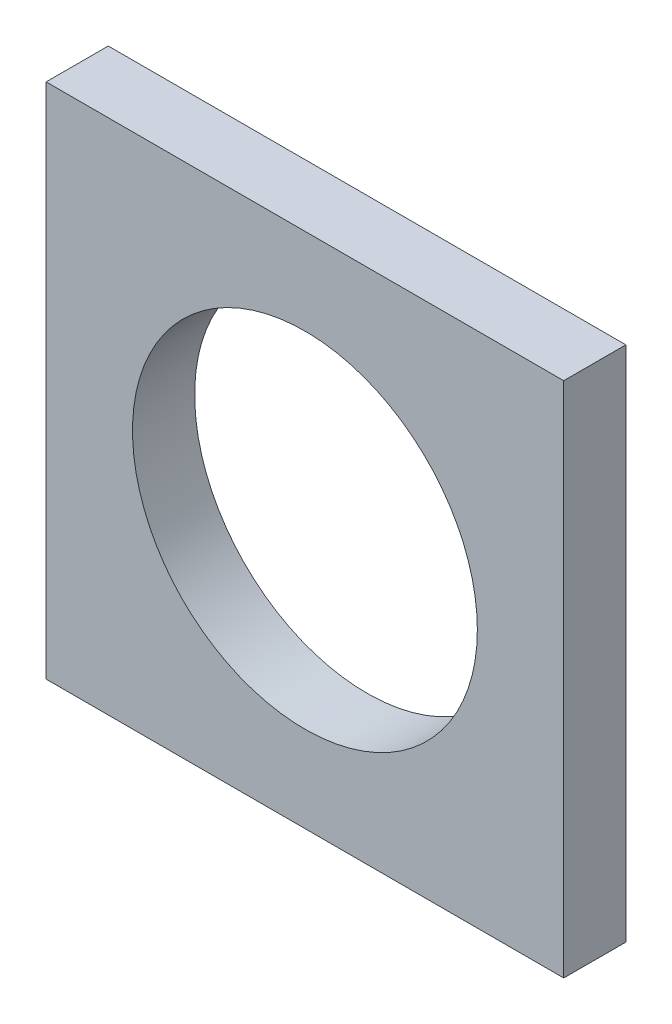
ISO-10303-21;
HEADER;
FILE_DESCRIPTION(('STEP AP214'),'2;1');
FILE_NAME('part.step','',(''),(''),'','','');
FILE_SCHEMA(('AUTOMOTIVE_DESIGN { 1 0 10303 214 1 1 1 1 }'));
ENDSEC;
DATA;
#1=APPLICATION_CONTEXT('core data for automotive mechanical design processes');
#2=APPLICATION_PROTOCOL_DEFINITION('international standard','automotive_design',2000,#1);
#3=PRODUCT_CONTEXT('',#1,'mechanical');
#4=PRODUCT('Part','Part','',(#3));
#5=PRODUCT_RELATED_PRODUCT_CATEGORY('part','',(#4));
#6=PRODUCT_DEFINITION_FORMATION('','',#4);
#7=PRODUCT_DEFINITION_CONTEXT('part definition',#1,'design');
#8=PRODUCT_DEFINITION('design','',#6,#7);
#9=PRODUCT_DEFINITION_SHAPE('','',#8);
#10=(LENGTH_UNIT() NAMED_UNIT(*) SI_UNIT(.MILLI.,.METRE.));
#11=(NAMED_UNIT(*) PLANE_ANGLE_UNIT() SI_UNIT($,.RADIAN.));
#12=(NAMED_UNIT(*) SI_UNIT($,.STERADIAN.) SOLID_ANGLE_UNIT());
#13=UNCERTAINTY_MEASURE_WITH_UNIT(LENGTH_MEASURE(1.E-05),#10,'distance_accuracy_value','');
#14=(GEOMETRIC_REPRESENTATION_CONTEXT(3) GLOBAL_UNCERTAINTY_ASSIGNED_CONTEXT((#13)) GLOBAL_UNIT_ASSIGNED_CONTEXT((#10,
#11,#12)) REPRESENTATION_CONTEXT('',''));
#15=CARTESIAN_POINT('',(0.,0.,0.));
#16=DIRECTION('',(0.,0.,1.));
#17=DIRECTION('',(1.,0.,0.));
#18=AXIS2_PLACEMENT_3D('',#15,#16,#17);
#19=CARTESIAN_POINT('',(109.926002502441,79.0619964599609,0.));
#20=DIRECTION('',(0.,-1.,0.));
#21=DIRECTION('',(-1.,0.,0.));
#22=AXIS2_PLACEMENT_3D('',#19,#20,#21);
#23=PLANE('',#22);
#24=DIRECTION('',(-1.,0.,0.));
#25=VECTOR('',#24,1.);
#26=CARTESIAN_POINT('',(109.926002502441,79.0619964599609,0.1999996));
#27=LINE('',#26,#25);
#28=CARTESIAN_POINT('',(109.926002502441,79.0619964599609,0.1999996));
#29=VERTEX_POINT('',#28);
#30=CARTESIAN_POINT('',(108.260002136231,79.0619964599609,0.1999996));
#31=VERTEX_POINT('',#30);
#32=EDGE_CURVE('E11',#29,#31,#27,.T.);
#33=ORIENTED_EDGE('',*,*,#32,.F.);
#34=DIRECTION('',(0.,0.,1.));
#35=VECTOR('',#34,1.);
#36=CARTESIAN_POINT('',(109.926002502441,79.0619964599609,0.));
#37=LINE('',#36,#35);
#38=CARTESIAN_POINT('',(109.926002502441,79.0619964599609,0.));
#39=VERTEX_POINT('',#38);
#40=EDGE_CURVE('E24',#39,#29,#37,.T.);
#41=ORIENTED_EDGE('',*,*,#40,.F.);
#42=DIRECTION('',(-1.,0.,0.));
#43=VECTOR('',#42,1.);
#44=CARTESIAN_POINT('',(109.926002502441,79.0619964599609,0.));
#45=LINE('',#44,#43);
#46=CARTESIAN_POINT('',(108.260002136231,79.0619964599609,0.));
#47=VERTEX_POINT('',#46);
#48=EDGE_CURVE('E96',#39,#47,#45,.T.);
#49=ORIENTED_EDGE('',*,*,#48,.T.);
#50=DIRECTION('',(0.,0.,1.));
#51=VECTOR('',#50,1.);
#52=CARTESIAN_POINT('',(108.260002136231,79.0619964599609,0.));
#53=LINE('',#52,#51);
#54=EDGE_CURVE('E37',#47,#31,#53,.T.);
#55=ORIENTED_EDGE('',*,*,#54,.T.);
#56=EDGE_LOOP('',(#33,#41,#49,#55));
#57=FACE_BOUND('',#56,.T.);
#58=ADVANCED_FACE('F17',(#57),#23,.F.);
#59=CARTESIAN_POINT('',(108.260002136231,79.0619964599609,0.));
#60=DIRECTION('',(1.,0.,0.));
#61=DIRECTION('',(0.,-1.,0.));
#62=AXIS2_PLACEMENT_3D('',#59,#60,#61);
#63=PLANE('',#62);
#64=DIRECTION('',(0.,-1.,0.));
#65=VECTOR('',#64,1.);
#66=CARTESIAN_POINT('',(108.260002136231,79.0619964599609,0.1999996));
#67=LINE('',#66,#65);
#68=CARTESIAN_POINT('',(108.260002136231,77.3970031738281,0.1999996));
#69=VERTEX_POINT('',#68);
#70=EDGE_CURVE('E92',#31,#69,#67,.T.);
#71=ORIENTED_EDGE('',*,*,#70,.F.);
#72=ORIENTED_EDGE('',*,*,#54,.F.);
#73=DIRECTION('',(0.,-1.,0.));
#74=VECTOR('',#73,1.);
#75=CARTESIAN_POINT('',(108.260002136231,79.0619964599609,0.));
#76=LINE('',#75,#74);
#77=CARTESIAN_POINT('',(108.260002136231,77.3970031738281,0.));
#78=VERTEX_POINT('',#77);
#79=EDGE_CURVE('E89',#47,#78,#76,.T.);
#80=ORIENTED_EDGE('',*,*,#79,.T.);
#81=DIRECTION('',(0.,0.,1.));
#82=VECTOR('',#81,1.);
#83=CARTESIAN_POINT('',(108.260002136231,77.3970031738281,0.));
#84=LINE('',#83,#82);
#85=EDGE_CURVE('E87',#78,#69,#84,.T.);
#86=ORIENTED_EDGE('',*,*,#85,.T.);
#87=EDGE_LOOP('',(#71,#72,#80,#86));
#88=FACE_BOUND('',#87,.T.);
#89=ADVANCED_FACE('F104',(#88),#63,.F.);
#90=CARTESIAN_POINT('',(108.260002136231,77.3970031738281,0.));
#91=DIRECTION('',(0.,1.,0.));
#92=DIRECTION('',(1.,0.,0.));
#93=AXIS2_PLACEMENT_3D('',#90,#91,#92);
#94=PLANE('',#93);
#95=DIRECTION('',(1.,0.,0.));
#96=VECTOR('',#95,1.);
#97=CARTESIAN_POINT('',(108.260002136231,77.3970031738281,0.1999996));
#98=LINE('',#97,#96);
#99=CARTESIAN_POINT('',(109.926002502441,77.3970031738281,0.1999996));
#100=VERTEX_POINT('',#99);
#101=EDGE_CURVE('E84',#69,#100,#98,.T.);
#102=ORIENTED_EDGE('',*,*,#101,.F.);
#103=ORIENTED_EDGE('',*,*,#85,.F.);
#104=DIRECTION('',(1.,0.,0.));
#105=VECTOR('',#104,1.);
#106=CARTESIAN_POINT('',(108.260002136231,77.3970031738281,0.));
#107=LINE('',#106,#105);
#108=CARTESIAN_POINT('',(109.926002502441,77.3970031738281,0.));
#109=VERTEX_POINT('',#108);
#110=EDGE_CURVE('E81',#78,#109,#107,.T.);
#111=ORIENTED_EDGE('',*,*,#110,.T.);
#112=DIRECTION('',(0.,0.,1.));
#113=VECTOR('',#112,1.);
#114=CARTESIAN_POINT('',(109.926002502441,77.3970031738281,0.));
#115=LINE('',#114,#113);
#116=EDGE_CURVE('E79',#109,#100,#115,.T.);
#117=ORIENTED_EDGE('',*,*,#116,.T.);
#118=EDGE_LOOP('',(#102,#103,#111,#117));
#119=FACE_BOUND('',#118,.T.);
#120=ADVANCED_FACE('F110',(#119),#94,.F.);
#121=CARTESIAN_POINT('',(109.926002502441,77.3970031738281,0.));
#122=DIRECTION('',(-1.,0.,0.));
#123=DIRECTION('',(0.,1.,0.));
#124=AXIS2_PLACEMENT_3D('',#121,#122,#123);
#125=PLANE('',#124);
#126=DIRECTION('',(0.,1.,0.));
#127=VECTOR('',#126,1.);
#128=CARTESIAN_POINT('',(109.926002502441,77.3970031738281,0.1999996));
#129=LINE('',#128,#127);
#130=EDGE_CURVE('E76',#100,#29,#129,.T.);
#131=ORIENTED_EDGE('',*,*,#130,.F.);
#132=ORIENTED_EDGE('',*,*,#116,.F.);
#133=DIRECTION('',(0.,1.,0.));
#134=VECTOR('',#133,1.);
#135=CARTESIAN_POINT('',(109.926002502441,77.3970031738281,0.));
#136=LINE('',#135,#134);
#137=EDGE_CURVE('E68',#109,#39,#136,.T.);
#138=ORIENTED_EDGE('',*,*,#137,.T.);
#139=ORIENTED_EDGE('',*,*,#40,.T.);
#140=EDGE_LOOP('',(#131,#132,#138,#139));
#141=FACE_BOUND('',#140,.T.);
#142=ADVANCED_FACE('F111',(#141),#125,.F.);
#143=CARTESIAN_POINT('',(109.093,78.2290028,0.));
#144=DIRECTION('',(0.,0.,-1.));
#145=DIRECTION('',(1.,0.,0.));
#146=AXIS2_PLACEMENT_3D('',#143,#144,#145);
#147=CYLINDRICAL_SURFACE('',#146,0.55500016);
#148=DIRECTION('',(0.,0.,1.));
#149=VECTOR('',#148,1.);
#150=CARTESIAN_POINT('',(109.64800016,78.2290028,0.));
#151=LINE('',#150,#149);
#152=CARTESIAN_POINT('',(109.64800016,78.2290028,0.));
#153=VERTEX_POINT('',#152);
#154=CARTESIAN_POINT('',(109.64800016,78.2290028,0.1999996));
#155=VERTEX_POINT('',#154);
#156=EDGE_CURVE('E62',#153,#155,#151,.T.);
#157=ORIENTED_EDGE('',*,*,#156,.T.);
#158=CARTESIAN_POINT('',(109.093,78.2290028,0.1999996));
#159=DIRECTION('',(0.,0.,1.));
#160=DIRECTION('',(1.,0.,0.));
#161=AXIS2_PLACEMENT_3D('',#158,#159,#160);
#162=CIRCLE('',#161,0.55500016);
#163=EDGE_CURVE('E67',#155,#155,#162,.T.);
#164=ORIENTED_EDGE('',*,*,#163,.T.);
#165=ORIENTED_EDGE('',*,*,#156,.F.);
#166=CARTESIAN_POINT('',(109.093,78.2290028,0.));
#167=DIRECTION('',(0.,0.,1.));
#168=DIRECTION('',(1.,0.,0.));
#169=AXIS2_PLACEMENT_3D('',#166,#167,#168);
#170=CIRCLE('',#169,0.55500016);
#171=EDGE_CURVE('E65',#153,#153,#170,.T.);
#172=ORIENTED_EDGE('',*,*,#171,.F.);
#173=EDGE_LOOP('',(#157,#164,#165,#172));
#174=FACE_BOUND('',#173,.T.);
#175=ADVANCED_FACE('F64',(#174),#147,.F.);
#176=CARTESIAN_POINT('',(109.926002502441,79.0619964599609,0.));
#177=DIRECTION('',(0.,0.,-1.));
#178=DIRECTION('',(-1.,0.,0.));
#179=AXIS2_PLACEMENT_3D('',#176,#177,#178);
#180=PLANE('',#179);
#181=ORIENTED_EDGE('',*,*,#137,.F.);
#182=ORIENTED_EDGE('',*,*,#110,.F.);
#183=ORIENTED_EDGE('',*,*,#79,.F.);
#184=ORIENTED_EDGE('',*,*,#48,.F.);
#185=EDGE_LOOP('',(#181,#182,#183,#184));
#186=FACE_BOUND('',#185,.T.);
#187=ORIENTED_EDGE('',*,*,#171,.T.);
#188=EDGE_LOOP('',(#187));
#189=FACE_BOUND('',#188,.T.);
#190=ADVANCED_FACE('F71',(#186,#189),#180,.T.);
#191=CARTESIAN_POINT('',(109.926002502441,79.0619964599609,0.1999996));
#192=DIRECTION('',(0.,0.,-1.));
#193=DIRECTION('',(-1.,0.,0.));
#194=AXIS2_PLACEMENT_3D('',#191,#192,#193);
#195=PLANE('',#194);
#196=ORIENTED_EDGE('',*,*,#32,.T.);
#197=ORIENTED_EDGE('',*,*,#70,.T.);
#198=ORIENTED_EDGE('',*,*,#101,.T.);
#199=ORIENTED_EDGE('',*,*,#130,.T.);
#200=EDGE_LOOP('',(#196,#197,#198,#199));
#201=FACE_BOUND('',#200,.T.);
#202=ORIENTED_EDGE('',*,*,#163,.F.);
#203=EDGE_LOOP('',(#202));
#204=FACE_BOUND('',#203,.T.);
#205=ADVANCED_FACE('F107',(#201,#204),#195,.F.);
#206=CLOSED_SHELL('',(#58,#89,#120,#142,#175,#190,#205));
#207=MANIFOLD_SOLID_BREP('B1',#206);
#208=ADVANCED_BREP_SHAPE_REPRESENTATION('',(#18,#207),#14);
#209=SHAPE_DEFINITION_REPRESENTATION(#9,#208);
ENDSEC;
END-ISO-10303-21;
